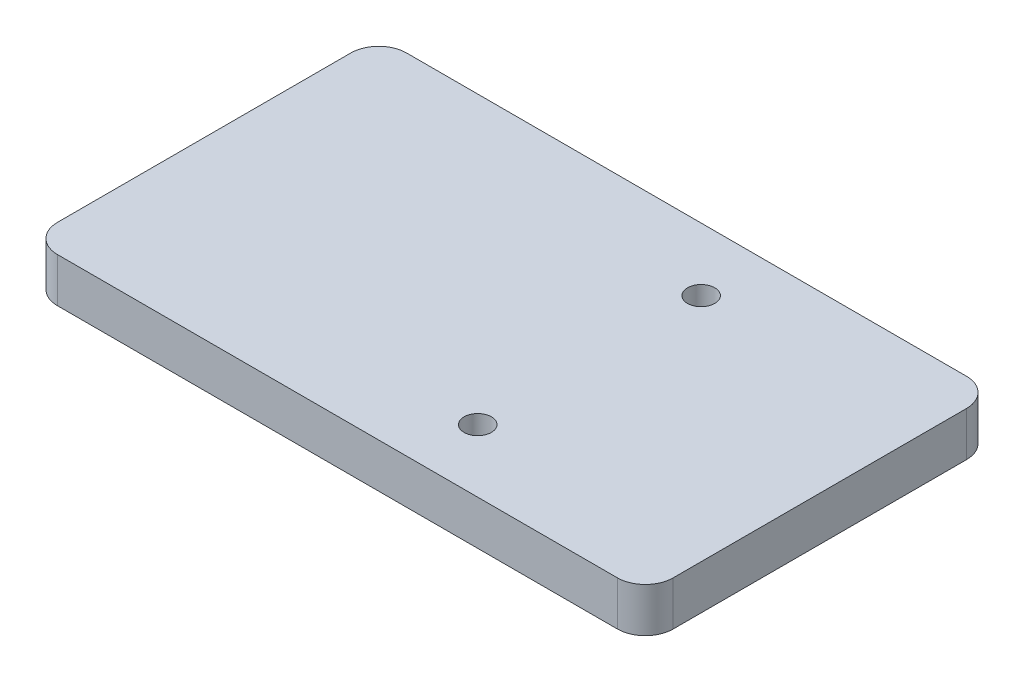
ISO-10303-21;
HEADER;
FILE_DESCRIPTION(('STEP AP214'),'2;1');
FILE_NAME('part.step','',(''),(''),'','','');
FILE_SCHEMA(('AUTOMOTIVE_DESIGN { 1 0 10303 214 1 1 1 1 }'));
ENDSEC;
DATA;
#1=APPLICATION_CONTEXT('core data for automotive mechanical design processes');
#2=APPLICATION_PROTOCOL_DEFINITION('international standard','automotive_design',2000,#1);
#3=PRODUCT_CONTEXT('',#1,'mechanical');
#4=PRODUCT('Part','Part','',(#3));
#5=PRODUCT_RELATED_PRODUCT_CATEGORY('part','',(#4));
#6=PRODUCT_DEFINITION_FORMATION('','',#4);
#7=PRODUCT_DEFINITION_CONTEXT('part definition',#1,'design');
#8=PRODUCT_DEFINITION('design','',#6,#7);
#9=PRODUCT_DEFINITION_SHAPE('','',#8);
#10=(LENGTH_UNIT() NAMED_UNIT(*) SI_UNIT(.MILLI.,.METRE.));
#11=(NAMED_UNIT(*) PLANE_ANGLE_UNIT() SI_UNIT($,.RADIAN.));
#12=(NAMED_UNIT(*) SI_UNIT($,.STERADIAN.) SOLID_ANGLE_UNIT());
#13=UNCERTAINTY_MEASURE_WITH_UNIT(LENGTH_MEASURE(1.E-05),#10,'distance_accuracy_value','');
#14=(GEOMETRIC_REPRESENTATION_CONTEXT(3) GLOBAL_UNCERTAINTY_ASSIGNED_CONTEXT((#13)) GLOBAL_UNIT_ASSIGNED_CONTEXT((#10,
#11,#12)) REPRESENTATION_CONTEXT('',''));
#15=CARTESIAN_POINT('',(0.,0.,0.));
#16=DIRECTION('',(0.,0.,1.));
#17=DIRECTION('',(1.,0.,0.));
#18=AXIS2_PLACEMENT_3D('',#15,#16,#17);
#19=CARTESIAN_POINT('',(0.,6.35,0.));
#20=DIRECTION('',(0.,1.,0.));
#21=DIRECTION('',(0.,0.,1.));
#22=AXIS2_PLACEMENT_3D('',#19,#20,#21);
#23=PLANE('',#22);
#24=CARTESIAN_POINT('',(11.09,6.35,-16.));
#25=DIRECTION('',(0.,1.,0.));
#26=DIRECTION('',(0.,0.,1.));
#27=AXIS2_PLACEMENT_3D('',#24,#25,#26);
#28=CIRCLE('',#27,1.95);
#29=CARTESIAN_POINT('',(11.09,6.35,-14.05));
#30=VERTEX_POINT('',#29);
#31=EDGE_CURVE('E168',#30,#30,#28,.T.);
#32=ORIENTED_EDGE('',*,*,#31,.F.);
#33=EDGE_LOOP('',(#32));
#34=FACE_BOUND('',#33,.T.);
#35=DIRECTION('',(0.,0.,1.));
#36=VECTOR('',#35,1.);
#37=CARTESIAN_POINT('',(-44.09,6.35,-25.));
#38=LINE('',#37,#36);
#39=CARTESIAN_POINT('',(-44.09,6.35,-21.));
#40=VERTEX_POINT('',#39);
#41=CARTESIAN_POINT('',(-44.09,6.35,21.));
#42=VERTEX_POINT('',#41);
#43=EDGE_CURVE('E172',#40,#42,#38,.T.);
#44=ORIENTED_EDGE('',*,*,#43,.T.);
#45=CARTESIAN_POINT('',(-40.09,6.35,21.));
#46=DIRECTION('',(0.,1.,0.));
#47=DIRECTION('',(0.,0.,1.));
#48=AXIS2_PLACEMENT_3D('',#45,#46,#47);
#49=CIRCLE('',#48,4.);
#50=CARTESIAN_POINT('',(-40.09,6.35,25.));
#51=VERTEX_POINT('',#50);
#52=EDGE_CURVE('E149',#42,#51,#49,.T.);
#53=ORIENTED_EDGE('',*,*,#52,.T.);
#54=DIRECTION('',(1.,0.,0.));
#55=VECTOR('',#54,1.);
#56=CARTESIAN_POINT('',(-44.09,6.35,25.));
#57=LINE('',#56,#55);
#58=CARTESIAN_POINT('',(40.09,6.35,25.));
#59=VERTEX_POINT('',#58);
#60=EDGE_CURVE('E120',#51,#59,#57,.T.);
#61=ORIENTED_EDGE('',*,*,#60,.T.);
#62=CARTESIAN_POINT('',(40.09,6.35,21.));
#63=DIRECTION('',(0.,1.,0.));
#64=DIRECTION('',(0.,0.,1.));
#65=AXIS2_PLACEMENT_3D('',#62,#63,#64);
#66=CIRCLE('',#65,4.);
#67=CARTESIAN_POINT('',(44.09,6.35,21.));
#68=VERTEX_POINT('',#67);
#69=EDGE_CURVE('E145',#59,#68,#66,.T.);
#70=ORIENTED_EDGE('',*,*,#69,.T.);
#71=DIRECTION('',(0.,0.,-1.));
#72=VECTOR('',#71,1.);
#73=CARTESIAN_POINT('',(44.09,6.35,-25.));
#74=LINE('',#73,#72);
#75=CARTESIAN_POINT('',(44.09,6.35,-21.));
#76=VERTEX_POINT('',#75);
#77=EDGE_CURVE('E128',#68,#76,#74,.T.);
#78=ORIENTED_EDGE('',*,*,#77,.T.);
#79=CARTESIAN_POINT('',(40.09,6.35,-21.));
#80=DIRECTION('',(0.,1.,0.));
#81=DIRECTION('',(0.,0.,1.));
#82=AXIS2_PLACEMENT_3D('',#79,#80,#81);
#83=CIRCLE('',#82,4.);
#84=CARTESIAN_POINT('',(40.09,6.35,-25.));
#85=VERTEX_POINT('',#84);
#86=EDGE_CURVE('E55',#76,#85,#83,.T.);
#87=ORIENTED_EDGE('',*,*,#86,.T.);
#88=DIRECTION('',(-1.,0.,0.));
#89=VECTOR('',#88,1.);
#90=CARTESIAN_POINT('',(-44.09,6.35,-25.));
#91=LINE('',#90,#89);
#92=CARTESIAN_POINT('',(-40.09,6.35,-25.));
#93=VERTEX_POINT('',#92);
#94=EDGE_CURVE('E131',#85,#93,#91,.T.);
#95=ORIENTED_EDGE('',*,*,#94,.T.);
#96=CARTESIAN_POINT('',(-40.09,6.35,-21.));
#97=DIRECTION('',(0.,1.,0.));
#98=DIRECTION('',(0.,0.,1.));
#99=AXIS2_PLACEMENT_3D('',#96,#97,#98);
#100=CIRCLE('',#99,4.);
#101=EDGE_CURVE('E147',#93,#40,#100,.T.);
#102=ORIENTED_EDGE('',*,*,#101,.T.);
#103=EDGE_LOOP('',(#44,#53,#61,#70,#78,#87,#95,#102));
#104=FACE_BOUND('',#103,.T.);
#105=CARTESIAN_POINT('',(11.09,6.35,16.));
#106=DIRECTION('',(0.,1.,0.));
#107=DIRECTION('',(0.,0.,1.));
#108=AXIS2_PLACEMENT_3D('',#105,#106,#107);
#109=CIRCLE('',#108,1.95);
#110=CARTESIAN_POINT('',(11.09,6.35,17.95));
#111=VERTEX_POINT('',#110);
#112=EDGE_CURVE('E178',#111,#111,#109,.T.);
#113=ORIENTED_EDGE('',*,*,#112,.F.);
#114=EDGE_LOOP('',(#113));
#115=FACE_BOUND('',#114,.T.);
#116=ADVANCED_FACE('F33',(#34,#104,#115),#23,.T.);
#117=CARTESIAN_POINT('',(0.,0.,0.));
#118=DIRECTION('',(0.,1.,0.));
#119=DIRECTION('',(0.,0.,1.));
#120=AXIS2_PLACEMENT_3D('',#117,#118,#119);
#121=PLANE('',#120);
#122=DIRECTION('',(1.,0.,0.));
#123=VECTOR('',#122,1.);
#124=CARTESIAN_POINT('',(-44.09,0.,25.));
#125=LINE('',#124,#123);
#126=CARTESIAN_POINT('',(-40.09,0.,25.));
#127=VERTEX_POINT('',#126);
#128=CARTESIAN_POINT('',(40.09,0.,25.));
#129=VERTEX_POINT('',#128);
#130=EDGE_CURVE('E117',#127,#129,#125,.T.);
#131=ORIENTED_EDGE('',*,*,#130,.F.);
#132=CARTESIAN_POINT('',(-40.09,0.,21.));
#133=DIRECTION('',(0.,1.,0.));
#134=DIRECTION('',(0.,0.,1.));
#135=AXIS2_PLACEMENT_3D('',#132,#133,#134);
#136=CIRCLE('',#135,4.);
#137=CARTESIAN_POINT('',(-44.09,0.,21.));
#138=VERTEX_POINT('',#137);
#139=EDGE_CURVE('E100',#127,#138,#136,.F.);
#140=ORIENTED_EDGE('',*,*,#139,.T.);
#141=DIRECTION('',(0.,0.,1.));
#142=VECTOR('',#141,1.);
#143=CARTESIAN_POINT('',(-44.09,0.,-25.));
#144=LINE('',#143,#142);
#145=CARTESIAN_POINT('',(-44.09,0.,-21.));
#146=VERTEX_POINT('',#145);
#147=EDGE_CURVE('E129',#146,#138,#144,.T.);
#148=ORIENTED_EDGE('',*,*,#147,.F.);
#149=CARTESIAN_POINT('',(-40.09,0.,-21.));
#150=DIRECTION('',(0.,1.,0.));
#151=DIRECTION('',(0.,0.,1.));
#152=AXIS2_PLACEMENT_3D('',#149,#150,#151);
#153=CIRCLE('',#152,4.);
#154=CARTESIAN_POINT('',(-40.09,0.,-25.));
#155=VERTEX_POINT('',#154);
#156=EDGE_CURVE('E111',#146,#155,#153,.F.);
#157=ORIENTED_EDGE('',*,*,#156,.T.);
#158=DIRECTION('',(-1.,0.,0.));
#159=VECTOR('',#158,1.);
#160=CARTESIAN_POINT('',(-44.09,0.,-25.));
#161=LINE('',#160,#159);
#162=CARTESIAN_POINT('',(40.09,0.,-25.));
#163=VERTEX_POINT('',#162);
#164=EDGE_CURVE('E133',#163,#155,#161,.T.);
#165=ORIENTED_EDGE('',*,*,#164,.F.);
#166=CARTESIAN_POINT('',(40.09,0.,-21.));
#167=DIRECTION('',(0.,1.,0.));
#168=DIRECTION('',(0.,0.,1.));
#169=AXIS2_PLACEMENT_3D('',#166,#167,#168);
#170=CIRCLE('',#169,4.);
#171=CARTESIAN_POINT('',(44.09,0.,-21.));
#172=VERTEX_POINT('',#171);
#173=EDGE_CURVE('E121',#163,#172,#170,.F.);
#174=ORIENTED_EDGE('',*,*,#173,.T.);
#175=DIRECTION('',(0.,0.,-1.));
#176=VECTOR('',#175,1.);
#177=CARTESIAN_POINT('',(44.09,0.,-25.));
#178=LINE('',#177,#176);
#179=CARTESIAN_POINT('',(44.09,0.,21.));
#180=VERTEX_POINT('',#179);
#181=EDGE_CURVE('E160',#180,#172,#178,.T.);
#182=ORIENTED_EDGE('',*,*,#181,.F.);
#183=CARTESIAN_POINT('',(40.09,0.,21.));
#184=DIRECTION('',(0.,1.,0.));
#185=DIRECTION('',(0.,0.,1.));
#186=AXIS2_PLACEMENT_3D('',#183,#184,#185);
#187=CIRCLE('',#186,4.);
#188=EDGE_CURVE('E127',#180,#129,#187,.F.);
#189=ORIENTED_EDGE('',*,*,#188,.T.);
#190=EDGE_LOOP('',(#131,#140,#148,#157,#165,#174,#182,#189));
#191=FACE_BOUND('',#190,.T.);
#192=CARTESIAN_POINT('',(11.09,0.,-16.));
#193=DIRECTION('',(0.,1.,0.));
#194=DIRECTION('',(0.,0.,1.));
#195=AXIS2_PLACEMENT_3D('',#192,#193,#194);
#196=CIRCLE('',#195,1.95);
#197=CARTESIAN_POINT('',(11.09,0.,-14.05));
#198=VERTEX_POINT('',#197);
#199=EDGE_CURVE('E175',#198,#198,#196,.T.);
#200=ORIENTED_EDGE('',*,*,#199,.T.);
#201=EDGE_LOOP('',(#200));
#202=FACE_BOUND('',#201,.T.);
#203=CARTESIAN_POINT('',(11.09,0.,16.));
#204=DIRECTION('',(0.,1.,0.));
#205=DIRECTION('',(0.,0.,1.));
#206=AXIS2_PLACEMENT_3D('',#203,#204,#205);
#207=CIRCLE('',#206,1.95);
#208=CARTESIAN_POINT('',(11.09,0.,17.95));
#209=VERTEX_POINT('',#208);
#210=EDGE_CURVE('E181',#209,#209,#207,.T.);
#211=ORIENTED_EDGE('',*,*,#210,.T.);
#212=EDGE_LOOP('',(#211));
#213=FACE_BOUND('',#212,.T.);
#214=ADVANCED_FACE('F124',(#191,#202,#213),#121,.F.);
#215=CARTESIAN_POINT('',(44.09,6.35,-25.));
#216=DIRECTION('',(-1.,0.,0.));
#217=DIRECTION('',(0.,0.,1.));
#218=AXIS2_PLACEMENT_3D('',#215,#216,#217);
#219=PLANE('',#218);
#220=ORIENTED_EDGE('',*,*,#77,.F.);
#221=DIRECTION('',(0.,-1.,0.));
#222=VECTOR('',#221,1.);
#223=CARTESIAN_POINT('',(44.09,6.35,21.));
#224=LINE('',#223,#222);
#225=EDGE_CURVE('E11',#68,#180,#224,.T.);
#226=ORIENTED_EDGE('',*,*,#225,.T.);
#227=ORIENTED_EDGE('',*,*,#181,.T.);
#228=DIRECTION('',(0.,-1.,0.));
#229=VECTOR('',#228,1.);
#230=CARTESIAN_POINT('',(44.09,6.35,-21.));
#231=LINE('',#230,#229);
#232=EDGE_CURVE('E41',#172,#76,#231,.F.);
#233=ORIENTED_EDGE('',*,*,#232,.T.);
#234=EDGE_LOOP('',(#220,#226,#227,#233));
#235=FACE_BOUND('',#234,.T.);
#236=ADVANCED_FACE('F158',(#235),#219,.F.);
#237=CARTESIAN_POINT('',(-44.09,6.35,-25.));
#238=DIRECTION('',(0.,0.,1.));
#239=DIRECTION('',(1.,0.,0.));
#240=AXIS2_PLACEMENT_3D('',#237,#238,#239);
#241=PLANE('',#240);
#242=ORIENTED_EDGE('',*,*,#164,.T.);
#243=DIRECTION('',(0.,-1.,0.));
#244=VECTOR('',#243,1.);
#245=CARTESIAN_POINT('',(-40.09,6.35,-25.));
#246=LINE('',#245,#244);
#247=EDGE_CURVE('E48',#155,#93,#246,.F.);
#248=ORIENTED_EDGE('',*,*,#247,.T.);
#249=ORIENTED_EDGE('',*,*,#94,.F.);
#250=DIRECTION('',(0.,-1.,0.));
#251=VECTOR('',#250,1.);
#252=CARTESIAN_POINT('',(40.09,6.35,-25.));
#253=LINE('',#252,#251);
#254=EDGE_CURVE('E151',#85,#163,#253,.T.);
#255=ORIENTED_EDGE('',*,*,#254,.T.);
#256=EDGE_LOOP('',(#242,#248,#249,#255));
#257=FACE_BOUND('',#256,.T.);
#258=ADVANCED_FACE('F167',(#257),#241,.F.);
#259=CARTESIAN_POINT('',(-44.09,6.35,-25.));
#260=DIRECTION('',(1.,0.,0.));
#261=DIRECTION('',(0.,0.,-1.));
#262=AXIS2_PLACEMENT_3D('',#259,#260,#261);
#263=PLANE('',#262);
#264=ORIENTED_EDGE('',*,*,#147,.T.);
#265=DIRECTION('',(0.,-1.,0.));
#266=VECTOR('',#265,1.);
#267=CARTESIAN_POINT('',(-44.09,6.35,21.));
#268=LINE('',#267,#266);
#269=EDGE_CURVE('E105',#138,#42,#268,.F.);
#270=ORIENTED_EDGE('',*,*,#269,.T.);
#271=ORIENTED_EDGE('',*,*,#43,.F.);
#272=DIRECTION('',(0.,-1.,0.));
#273=VECTOR('',#272,1.);
#274=CARTESIAN_POINT('',(-44.09,6.35,-21.));
#275=LINE('',#274,#273);
#276=EDGE_CURVE('E110',#40,#146,#275,.T.);
#277=ORIENTED_EDGE('',*,*,#276,.T.);
#278=EDGE_LOOP('',(#264,#270,#271,#277));
#279=FACE_BOUND('',#278,.T.);
#280=ADVANCED_FACE('F203',(#279),#263,.F.);
#281=CARTESIAN_POINT('',(-44.09,6.35,25.));
#282=DIRECTION('',(0.,0.,-1.));
#283=DIRECTION('',(-1.,0.,0.));
#284=AXIS2_PLACEMENT_3D('',#281,#282,#283);
#285=PLANE('',#284);
#286=ORIENTED_EDGE('',*,*,#60,.F.);
#287=DIRECTION('',(0.,-1.,0.));
#288=VECTOR('',#287,1.);
#289=CARTESIAN_POINT('',(-40.09,6.35,25.));
#290=LINE('',#289,#288);
#291=EDGE_CURVE('E104',#51,#127,#290,.T.);
#292=ORIENTED_EDGE('',*,*,#291,.T.);
#293=ORIENTED_EDGE('',*,*,#130,.T.);
#294=DIRECTION('',(0.,-1.,0.));
#295=VECTOR('',#294,1.);
#296=CARTESIAN_POINT('',(40.09,6.35,25.));
#297=LINE('',#296,#295);
#298=EDGE_CURVE('E122',#129,#59,#297,.F.);
#299=ORIENTED_EDGE('',*,*,#298,.T.);
#300=EDGE_LOOP('',(#286,#292,#293,#299));
#301=FACE_BOUND('',#300,.T.);
#302=ADVANCED_FACE('F116',(#301),#285,.F.);
#303=CARTESIAN_POINT('',(11.09,6.35,-16.));
#304=DIRECTION('',(0.,-1.,0.));
#305=DIRECTION('',(0.,0.,-1.));
#306=AXIS2_PLACEMENT_3D('',#303,#304,#305);
#307=CYLINDRICAL_SURFACE('',#306,1.95);
#308=ORIENTED_EDGE('',*,*,#31,.T.);
#309=EDGE_LOOP('',(#308));
#310=FACE_BOUND('',#309,.T.);
#311=ORIENTED_EDGE('',*,*,#199,.F.);
#312=EDGE_LOOP('',(#311));
#313=FACE_BOUND('',#312,.T.);
#314=ADVANCED_FACE('F198',(#310,#313),#307,.F.);
#315=CARTESIAN_POINT('',(11.09,6.35,16.));
#316=DIRECTION('',(0.,-1.,0.));
#317=DIRECTION('',(0.,0.,-1.));
#318=AXIS2_PLACEMENT_3D('',#315,#316,#317);
#319=CYLINDRICAL_SURFACE('',#318,1.95);
#320=ORIENTED_EDGE('',*,*,#112,.T.);
#321=EDGE_LOOP('',(#320));
#322=FACE_BOUND('',#321,.T.);
#323=ORIENTED_EDGE('',*,*,#210,.F.);
#324=EDGE_LOOP('',(#323));
#325=FACE_BOUND('',#324,.T.);
#326=ADVANCED_FACE('F187',(#322,#325),#319,.F.);
#327=CARTESIAN_POINT('',(-40.09,6.35,21.));
#328=DIRECTION('',(0.,-1.,0.));
#329=DIRECTION('',(0.,0.,-1.));
#330=AXIS2_PLACEMENT_3D('',#327,#328,#329);
#331=CYLINDRICAL_SURFACE('',#330,4.);
#332=ORIENTED_EDGE('',*,*,#52,.F.);
#333=ORIENTED_EDGE('',*,*,#269,.F.);
#334=ORIENTED_EDGE('',*,*,#139,.F.);
#335=ORIENTED_EDGE('',*,*,#291,.F.);
#336=EDGE_LOOP('',(#332,#333,#334,#335));
#337=FACE_BOUND('',#336,.T.);
#338=ADVANCED_FACE('F103',(#337),#331,.T.);
#339=CARTESIAN_POINT('',(-40.09,6.35,-21.));
#340=DIRECTION('',(0.,-1.,0.));
#341=DIRECTION('',(0.,0.,-1.));
#342=AXIS2_PLACEMENT_3D('',#339,#340,#341);
#343=CYLINDRICAL_SURFACE('',#342,4.);
#344=ORIENTED_EDGE('',*,*,#101,.F.);
#345=ORIENTED_EDGE('',*,*,#247,.F.);
#346=ORIENTED_EDGE('',*,*,#156,.F.);
#347=ORIENTED_EDGE('',*,*,#276,.F.);
#348=EDGE_LOOP('',(#344,#345,#346,#347));
#349=FACE_BOUND('',#348,.T.);
#350=ADVANCED_FACE('F213',(#349),#343,.T.);
#351=CARTESIAN_POINT('',(40.09,6.35,21.));
#352=DIRECTION('',(0.,-1.,0.));
#353=DIRECTION('',(0.,0.,-1.));
#354=AXIS2_PLACEMENT_3D('',#351,#352,#353);
#355=CYLINDRICAL_SURFACE('',#354,4.);
#356=ORIENTED_EDGE('',*,*,#69,.F.);
#357=ORIENTED_EDGE('',*,*,#298,.F.);
#358=ORIENTED_EDGE('',*,*,#188,.F.);
#359=ORIENTED_EDGE('',*,*,#225,.F.);
#360=EDGE_LOOP('',(#356,#357,#358,#359));
#361=FACE_BOUND('',#360,.T.);
#362=ADVANCED_FACE('F215',(#361),#355,.T.);
#363=CARTESIAN_POINT('',(40.09,6.35,-21.));
#364=DIRECTION('',(0.,-1.,0.));
#365=DIRECTION('',(0.,0.,-1.));
#366=AXIS2_PLACEMENT_3D('',#363,#364,#365);
#367=CYLINDRICAL_SURFACE('',#366,4.);
#368=ORIENTED_EDGE('',*,*,#86,.F.);
#369=ORIENTED_EDGE('',*,*,#232,.F.);
#370=ORIENTED_EDGE('',*,*,#173,.F.);
#371=ORIENTED_EDGE('',*,*,#254,.F.);
#372=EDGE_LOOP('',(#368,#369,#370,#371));
#373=FACE_BOUND('',#372,.T.);
#374=ADVANCED_FACE('F35',(#373),#367,.T.);
#375=CLOSED_SHELL('',(#116,#214,#236,#258,#280,#302,#314,#326,#338,#350,#362,#374));
#376=MANIFOLD_SOLID_BREP('B2',#375);
#377=ADVANCED_BREP_SHAPE_REPRESENTATION('',(#18,#376),#14);
#378=SHAPE_DEFINITION_REPRESENTATION(#9,#377);
ENDSEC;
END-ISO-10303-21;
